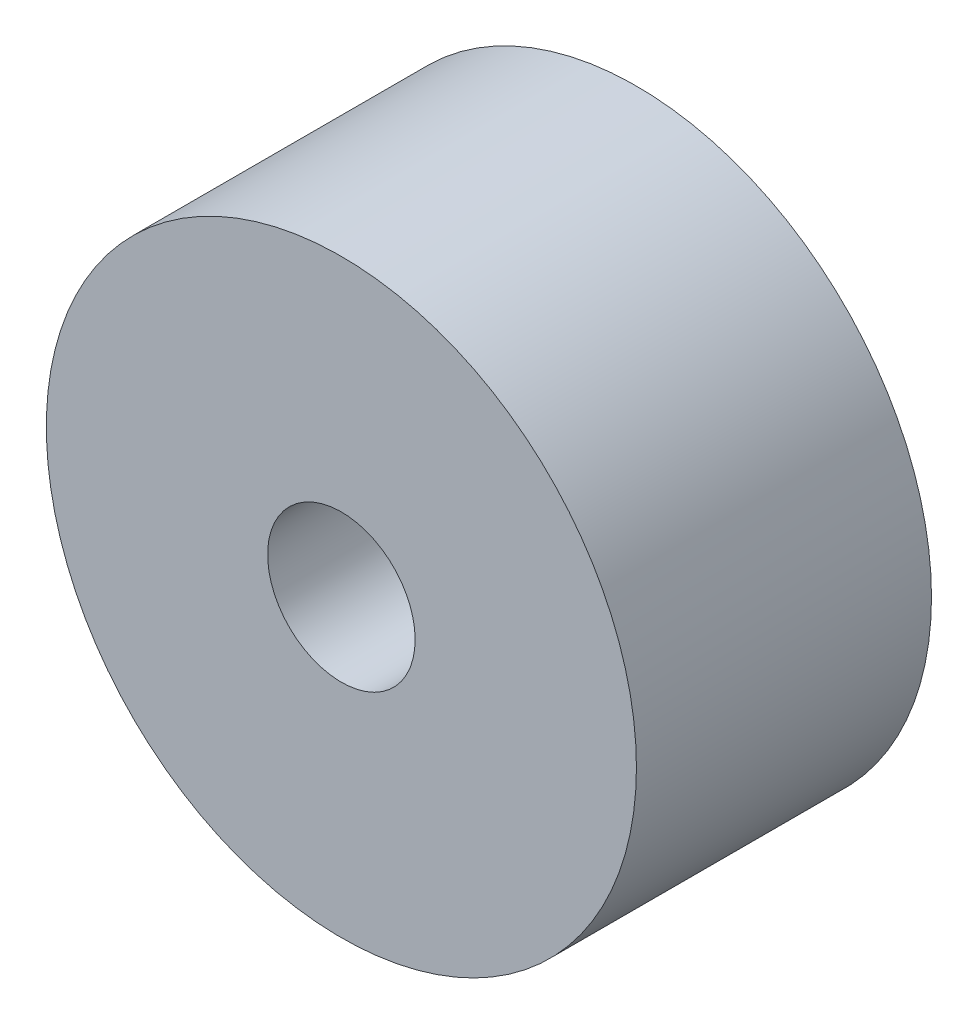
ISO-10303-21;
HEADER;
FILE_DESCRIPTION(('STEP AP214'),'2;1');
FILE_NAME('part.step','',(''),(''),'','','');
FILE_SCHEMA(('AUTOMOTIVE_DESIGN { 1 0 10303 214 1 1 1 1 }'));
ENDSEC;
DATA;
#1=APPLICATION_CONTEXT('core data for automotive mechanical design processes');
#2=APPLICATION_PROTOCOL_DEFINITION('international standard','automotive_design',2000,#1);
#3=PRODUCT_CONTEXT('',#1,'mechanical');
#4=PRODUCT('Part','Part','',(#3));
#5=PRODUCT_RELATED_PRODUCT_CATEGORY('part','',(#4));
#6=PRODUCT_DEFINITION_FORMATION('','',#4);
#7=PRODUCT_DEFINITION_CONTEXT('part definition',#1,'design');
#8=PRODUCT_DEFINITION('design','',#6,#7);
#9=PRODUCT_DEFINITION_SHAPE('','',#8);
#10=(LENGTH_UNIT() NAMED_UNIT(*) SI_UNIT(.MILLI.,.METRE.));
#11=(NAMED_UNIT(*) PLANE_ANGLE_UNIT() SI_UNIT($,.RADIAN.));
#12=(NAMED_UNIT(*) SI_UNIT($,.STERADIAN.) SOLID_ANGLE_UNIT());
#13=UNCERTAINTY_MEASURE_WITH_UNIT(LENGTH_MEASURE(1.E-05),#10,'distance_accuracy_value','');
#14=(GEOMETRIC_REPRESENTATION_CONTEXT(3) GLOBAL_UNCERTAINTY_ASSIGNED_CONTEXT((#13)) GLOBAL_UNIT_ASSIGNED_CONTEXT((#10,
#11,#12)) REPRESENTATION_CONTEXT('',''));
#15=CARTESIAN_POINT('',(0.,0.,0.));
#16=DIRECTION('',(0.,0.,1.));
#17=DIRECTION('',(1.,0.,0.));
#18=AXIS2_PLACEMENT_3D('',#15,#16,#17);
#19=CARTESIAN_POINT('',(0.,0.,10.));
#20=DIRECTION('',(0.,0.,1.));
#21=DIRECTION('',(1.,0.,0.));
#22=AXIS2_PLACEMENT_3D('',#19,#20,#21);
#23=PLANE('',#22);
#24=CARTESIAN_POINT('',(0.,0.,10.));
#25=DIRECTION('',(0.,0.,1.));
#26=DIRECTION('',(1.,0.,0.));
#27=AXIS2_PLACEMENT_3D('',#24,#25,#26);
#28=CIRCLE('',#27,10.);
#29=CARTESIAN_POINT('',(10.,0.,10.));
#30=VERTEX_POINT('',#29);
#31=EDGE_CURVE('E10',#30,#30,#28,.T.);
#32=ORIENTED_EDGE('',*,*,#31,.T.);
#33=EDGE_LOOP('',(#32));
#34=FACE_BOUND('',#33,.T.);
#35=CARTESIAN_POINT('',(0.,0.,10.));
#36=DIRECTION('',(0.,0.,1.));
#37=DIRECTION('',(1.,0.,0.));
#38=AXIS2_PLACEMENT_3D('',#35,#36,#37);
#39=CIRCLE('',#38,2.5);
#40=CARTESIAN_POINT('',(2.5,0.,10.));
#41=VERTEX_POINT('',#40);
#42=EDGE_CURVE('E42',#41,#41,#39,.T.);
#43=ORIENTED_EDGE('',*,*,#42,.F.);
#44=EDGE_LOOP('',(#43));
#45=FACE_BOUND('',#44,.T.);
#46=ADVANCED_FACE('F31',(#34,#45),#23,.T.);
#47=CARTESIAN_POINT('',(0.,0.,0.));
#48=DIRECTION('',(0.,0.,1.));
#49=DIRECTION('',(1.,0.,0.));
#50=AXIS2_PLACEMENT_3D('',#47,#48,#49);
#51=PLANE('',#50);
#52=CARTESIAN_POINT('',(0.,0.,0.));
#53=DIRECTION('',(0.,0.,1.));
#54=DIRECTION('',(1.,0.,0.));
#55=AXIS2_PLACEMENT_3D('',#52,#53,#54);
#56=CIRCLE('',#55,10.);
#57=CARTESIAN_POINT('',(10.,0.,0.));
#58=VERTEX_POINT('',#57);
#59=EDGE_CURVE('E35',#58,#58,#56,.T.);
#60=ORIENTED_EDGE('',*,*,#59,.F.);
#61=EDGE_LOOP('',(#60));
#62=FACE_BOUND('',#61,.T.);
#63=CARTESIAN_POINT('',(0.,0.,0.));
#64=DIRECTION('',(0.,0.,1.));
#65=DIRECTION('',(1.,0.,0.));
#66=AXIS2_PLACEMENT_3D('',#63,#64,#65);
#67=CIRCLE('',#66,2.5);
#68=CARTESIAN_POINT('',(2.5,0.,0.));
#69=VERTEX_POINT('',#68);
#70=EDGE_CURVE('E44',#69,#69,#67,.T.);
#71=ORIENTED_EDGE('',*,*,#70,.T.);
#72=EDGE_LOOP('',(#71));
#73=FACE_BOUND('',#72,.T.);
#74=ADVANCED_FACE('F54',(#62,#73),#51,.F.);
#75=CARTESIAN_POINT('',(0.,0.,10.));
#76=DIRECTION('',(0.,0.,-1.));
#77=DIRECTION('',(-1.,0.,0.));
#78=AXIS2_PLACEMENT_3D('',#75,#76,#77);
#79=CYLINDRICAL_SURFACE('',#78,10.);
#80=ORIENTED_EDGE('',*,*,#31,.F.);
#81=EDGE_LOOP('',(#80));
#82=FACE_BOUND('',#81,.T.);
#83=ORIENTED_EDGE('',*,*,#59,.T.);
#84=EDGE_LOOP('',(#83));
#85=FACE_BOUND('',#84,.T.);
#86=ADVANCED_FACE('F33',(#82,#85),#79,.T.);
#87=CARTESIAN_POINT('',(0.,0.,10.));
#88=DIRECTION('',(0.,0.,-1.));
#89=DIRECTION('',(-1.,0.,0.));
#90=AXIS2_PLACEMENT_3D('',#87,#88,#89);
#91=CYLINDRICAL_SURFACE('',#90,2.5);
#92=ORIENTED_EDGE('',*,*,#42,.T.);
#93=EDGE_LOOP('',(#92));
#94=FACE_BOUND('',#93,.T.);
#95=ORIENTED_EDGE('',*,*,#70,.F.);
#96=EDGE_LOOP('',(#95));
#97=FACE_BOUND('',#96,.T.);
#98=ADVANCED_FACE('F50',(#94,#97),#91,.F.);
#99=CLOSED_SHELL('',(#46,#74,#86,#98));
#100=MANIFOLD_SOLID_BREP('B2',#99);
#101=ADVANCED_BREP_SHAPE_REPRESENTATION('',(#18,#100),#14);
#102=SHAPE_DEFINITION_REPRESENTATION(#9,#101);
ENDSEC;
END-ISO-10303-21;
